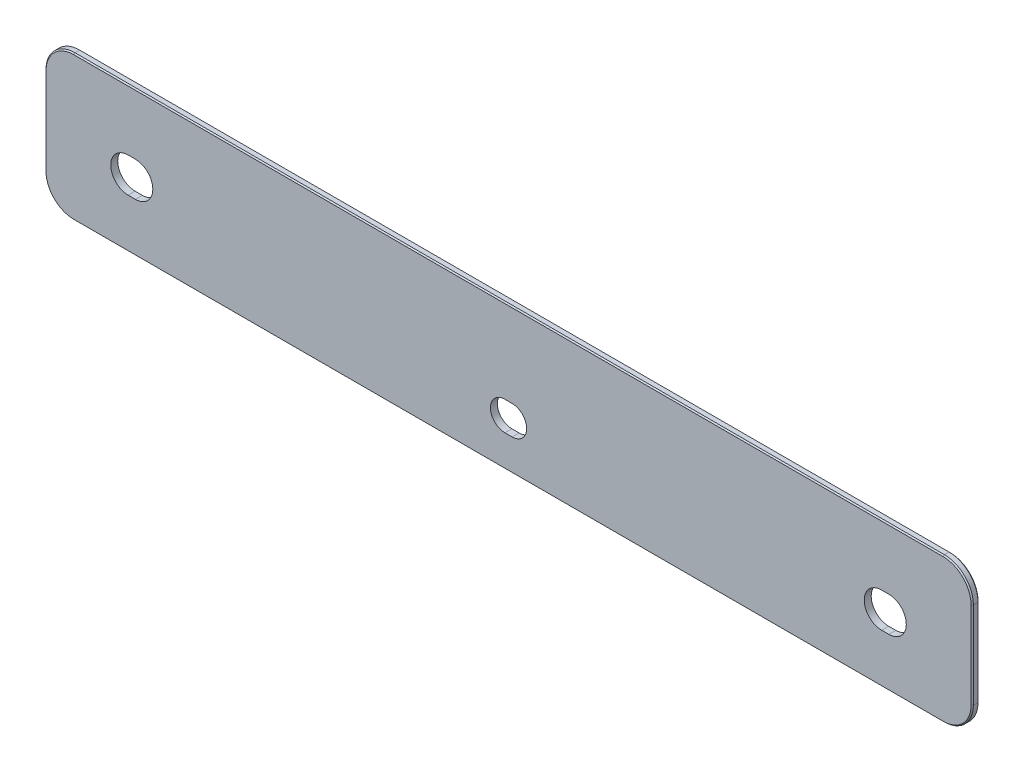
ISO-10303-21;
HEADER;
FILE_DESCRIPTION(('STEP AP214'),'2;1');
FILE_NAME('part.step','',(''),(''),'','','');
FILE_SCHEMA(('AUTOMOTIVE_DESIGN { 1 0 10303 214 1 1 1 1 }'));
ENDSEC;
DATA;
#1=APPLICATION_CONTEXT('core data for automotive mechanical design processes');
#2=APPLICATION_PROTOCOL_DEFINITION('international standard','automotive_design',2000,#1);
#3=PRODUCT_CONTEXT('',#1,'mechanical');
#4=PRODUCT('Part','Part','',(#3));
#5=PRODUCT_RELATED_PRODUCT_CATEGORY('part','',(#4));
#6=PRODUCT_DEFINITION_FORMATION('','',#4);
#7=PRODUCT_DEFINITION_CONTEXT('part definition',#1,'design');
#8=PRODUCT_DEFINITION('design','',#6,#7);
#9=PRODUCT_DEFINITION_SHAPE('','',#8);
#10=(LENGTH_UNIT() NAMED_UNIT(*) SI_UNIT(.MILLI.,.METRE.));
#11=(NAMED_UNIT(*) PLANE_ANGLE_UNIT() SI_UNIT($,.RADIAN.));
#12=(NAMED_UNIT(*) SI_UNIT($,.STERADIAN.) SOLID_ANGLE_UNIT());
#13=UNCERTAINTY_MEASURE_WITH_UNIT(LENGTH_MEASURE(1.E-05),#10,'distance_accuracy_value','');
#14=(GEOMETRIC_REPRESENTATION_CONTEXT(3) GLOBAL_UNCERTAINTY_ASSIGNED_CONTEXT((#13)) GLOBAL_UNIT_ASSIGNED_CONTEXT((#10,
#11,#12)) REPRESENTATION_CONTEXT('',''));
#15=CARTESIAN_POINT('',(0.,0.,0.));
#16=DIRECTION('',(0.,0.,1.));
#17=DIRECTION('',(1.,0.,0.));
#18=AXIS2_PLACEMENT_3D('',#15,#16,#17);
#19=CARTESIAN_POINT('',(0.,0.,2.4));
#20=DIRECTION('',(0.,0.,-1.));
#21=DIRECTION('',(-1.,0.,0.));
#22=AXIS2_PLACEMENT_3D('',#19,#20,#21);
#23=PLANE('',#22);
#24=CARTESIAN_POINT('',(150.,-13.,2.4));
#25=DIRECTION('',(0.,0.,-1.));
#26=DIRECTION('',(-1.,0.,0.));
#27=AXIS2_PLACEMENT_3D('',#24,#25,#26);
#28=CIRCLE('',#27,9.60000000000005);
#29=CARTESIAN_POINT('',(150.,-22.6000000000001,2.4));
#30=VERTEX_POINT('',#29);
#31=CARTESIAN_POINT('',(159.6,-13.,2.4));
#32=VERTEX_POINT('',#31);
#33=EDGE_CURVE('E367',#30,#32,#28,.F.);
#34=ORIENTED_EDGE('',*,*,#33,.T.);
#35=DIRECTION('',(0.,1.,0.));
#36=VECTOR('',#35,1.);
#37=CARTESIAN_POINT('',(159.6,0.,2.4));
#38=LINE('',#37,#36);
#39=CARTESIAN_POINT('',(159.6,17.,2.4));
#40=VERTEX_POINT('',#39);
#41=EDGE_CURVE('E371',#32,#40,#38,.T.);
#42=ORIENTED_EDGE('',*,*,#41,.T.);
#43=CARTESIAN_POINT('',(150.,17.,2.4));
#44=DIRECTION('',(0.,0.,-1.));
#45=DIRECTION('',(-1.,0.,0.));
#46=AXIS2_PLACEMENT_3D('',#43,#44,#45);
#47=CIRCLE('',#46,9.60000000000005);
#48=CARTESIAN_POINT('',(150.,26.6000000000001,2.4));
#49=VERTEX_POINT('',#48);
#50=EDGE_CURVE('E369',#40,#49,#47,.F.);
#51=ORIENTED_EDGE('',*,*,#50,.T.);
#52=DIRECTION('',(-1.,0.,0.));
#53=VECTOR('',#52,1.);
#54=CARTESIAN_POINT('',(0.,26.6000000000001,2.4));
#55=LINE('',#54,#53);
#56=CARTESIAN_POINT('',(-150.,26.6000000000001,2.4));
#57=VERTEX_POINT('',#56);
#58=EDGE_CURVE('E365',#49,#57,#55,.T.);
#59=ORIENTED_EDGE('',*,*,#58,.T.);
#60=CARTESIAN_POINT('',(-150.,17.,2.4));
#61=DIRECTION('',(0.,0.,-1.));
#62=DIRECTION('',(-1.,0.,0.));
#63=AXIS2_PLACEMENT_3D('',#60,#61,#62);
#64=CIRCLE('',#63,9.60000000000005);
#65=CARTESIAN_POINT('',(-159.6,17.,2.4));
#66=VERTEX_POINT('',#65);
#67=EDGE_CURVE('E361',#57,#66,#64,.F.);
#68=ORIENTED_EDGE('',*,*,#67,.T.);
#69=DIRECTION('',(0.,-1.,0.));
#70=VECTOR('',#69,1.);
#71=CARTESIAN_POINT('',(-159.6,0.,2.4));
#72=LINE('',#71,#70);
#73=CARTESIAN_POINT('',(-159.6,-13.,2.4));
#74=VERTEX_POINT('',#73);
#75=EDGE_CURVE('E357',#66,#74,#72,.T.);
#76=ORIENTED_EDGE('',*,*,#75,.T.);
#77=CARTESIAN_POINT('',(-150.,-13.,2.4));
#78=DIRECTION('',(0.,0.,-1.));
#79=DIRECTION('',(-1.,0.,0.));
#80=AXIS2_PLACEMENT_3D('',#77,#78,#79);
#81=CIRCLE('',#80,9.60000000000004);
#82=CARTESIAN_POINT('',(-150.,-22.6,2.4));
#83=VERTEX_POINT('',#82);
#84=EDGE_CURVE('E359',#74,#83,#81,.F.);
#85=ORIENTED_EDGE('',*,*,#84,.T.);
#86=DIRECTION('',(1.,0.,0.));
#87=VECTOR('',#86,1.);
#88=CARTESIAN_POINT('',(0.,-22.6000000000001,2.4));
#89=LINE('',#88,#87);
#90=EDGE_CURVE('E363',#83,#30,#89,.T.);
#91=ORIENTED_EDGE('',*,*,#90,.T.);
#92=EDGE_LOOP('',(#34,#42,#51,#59,#68,#76,#85,#91));
#93=FACE_BOUND('',#92,.T.);
#94=CARTESIAN_POINT('',(131.25,0.,2.4));
#95=DIRECTION('',(0.,0.,1.));
#96=DIRECTION('',(1.,0.,0.));
#97=AXIS2_PLACEMENT_3D('',#94,#95,#96);
#98=CIRCLE('',#97,6.00000000000001);
#99=CARTESIAN_POINT('',(131.25,-5.99999999999999,2.4));
#100=VERTEX_POINT('',#99);
#101=CARTESIAN_POINT('',(131.25,6.00000000000003,2.4));
#102=VERTEX_POINT('',#101);
#103=EDGE_CURVE('E272',#100,#102,#98,.T.);
#104=ORIENTED_EDGE('',*,*,#103,.F.);
#105=DIRECTION('',(1.,0.,0.));
#106=VECTOR('',#105,1.);
#107=CARTESIAN_POINT('',(131.25,-5.99999999999999,2.4));
#108=LINE('',#107,#106);
#109=CARTESIAN_POINT('',(128.75,-5.99999999999999,2.4));
#110=VERTEX_POINT('',#109);
#111=EDGE_CURVE('E280',#110,#100,#108,.T.);
#112=ORIENTED_EDGE('',*,*,#111,.F.);
#113=CARTESIAN_POINT('',(128.75,0.,2.4));
#114=DIRECTION('',(0.,0.,1.));
#115=DIRECTION('',(1.,0.,0.));
#116=AXIS2_PLACEMENT_3D('',#113,#114,#115);
#117=CIRCLE('',#116,6.00000000000001);
#118=CARTESIAN_POINT('',(128.75,6.00000000000002,2.4));
#119=VERTEX_POINT('',#118);
#120=EDGE_CURVE('E277',#119,#110,#117,.T.);
#121=ORIENTED_EDGE('',*,*,#120,.F.);
#122=DIRECTION('',(-1.,0.,0.));
#123=VECTOR('',#122,1.);
#124=CARTESIAN_POINT('',(131.25,6.00000000000003,2.4));
#125=LINE('',#124,#123);
#126=EDGE_CURVE('E274',#102,#119,#125,.T.);
#127=ORIENTED_EDGE('',*,*,#126,.F.);
#128=EDGE_LOOP('',(#104,#112,#121,#127));
#129=FACE_BOUND('',#128,.T.);
#130=CARTESIAN_POINT('',(-128.75,0.,2.4));
#131=DIRECTION('',(0.,0.,1.));
#132=DIRECTION('',(1.,0.,0.));
#133=AXIS2_PLACEMENT_3D('',#130,#131,#132);
#134=CIRCLE('',#133,6.00000000000005);
#135=CARTESIAN_POINT('',(-128.75,-6.00000000000005,2.4));
#136=VERTEX_POINT('',#135);
#137=CARTESIAN_POINT('',(-128.75,6.00000000000005,2.4));
#138=VERTEX_POINT('',#137);
#139=EDGE_CURVE('E303',#136,#138,#134,.T.);
#140=ORIENTED_EDGE('',*,*,#139,.F.);
#141=DIRECTION('',(1.,0.,0.));
#142=VECTOR('',#141,1.);
#143=CARTESIAN_POINT('',(-128.75,-6.00000000000005,2.4));
#144=LINE('',#143,#142);
#145=CARTESIAN_POINT('',(-131.25,-6.00000000000005,2.4));
#146=VERTEX_POINT('',#145);
#147=EDGE_CURVE('E311',#146,#136,#144,.T.);
#148=ORIENTED_EDGE('',*,*,#147,.F.);
#149=CARTESIAN_POINT('',(-131.25,0.,2.4));
#150=DIRECTION('',(0.,0.,1.));
#151=DIRECTION('',(1.,0.,0.));
#152=AXIS2_PLACEMENT_3D('',#149,#150,#151);
#153=CIRCLE('',#152,6.00000000000005);
#154=CARTESIAN_POINT('',(-131.25,6.00000000000005,2.4));
#155=VERTEX_POINT('',#154);
#156=EDGE_CURVE('E308',#155,#146,#153,.T.);
#157=ORIENTED_EDGE('',*,*,#156,.F.);
#158=DIRECTION('',(-1.,0.,0.));
#159=VECTOR('',#158,1.);
#160=CARTESIAN_POINT('',(-128.75,6.00000000000005,2.4));
#161=LINE('',#160,#159);
#162=EDGE_CURVE('E305',#138,#155,#161,.T.);
#163=ORIENTED_EDGE('',*,*,#162,.F.);
#164=EDGE_LOOP('',(#140,#148,#157,#163));
#165=FACE_BOUND('',#164,.T.);
#166=CARTESIAN_POINT('',(-1.25,-7.,2.4));
#167=DIRECTION('',(0.,0.,1.));
#168=DIRECTION('',(1.,0.,0.));
#169=AXIS2_PLACEMENT_3D('',#166,#167,#168);
#170=CIRCLE('',#169,5.);
#171=CARTESIAN_POINT('',(-1.25,-2.,2.4));
#172=VERTEX_POINT('',#171);
#173=CARTESIAN_POINT('',(-1.25,-12.,2.4));
#174=VERTEX_POINT('',#173);
#175=EDGE_CURVE('E230',#172,#174,#170,.T.);
#176=ORIENTED_EDGE('',*,*,#175,.F.);
#177=DIRECTION('',(-1.,0.,0.));
#178=VECTOR('',#177,1.);
#179=CARTESIAN_POINT('',(-1.25,-2.,2.4));
#180=LINE('',#179,#178);
#181=CARTESIAN_POINT('',(1.25,-2.,2.4));
#182=VERTEX_POINT('',#181);
#183=EDGE_CURVE('E255',#182,#172,#180,.T.);
#184=ORIENTED_EDGE('',*,*,#183,.F.);
#185=CARTESIAN_POINT('',(1.25,-7.,2.4));
#186=DIRECTION('',(0.,0.,1.));
#187=DIRECTION('',(1.,0.,0.));
#188=AXIS2_PLACEMENT_3D('',#185,#186,#187);
#189=CIRCLE('',#188,5.);
#190=CARTESIAN_POINT('',(1.25,-12.,2.4));
#191=VERTEX_POINT('',#190);
#192=EDGE_CURVE('E253',#191,#182,#189,.T.);
#193=ORIENTED_EDGE('',*,*,#192,.F.);
#194=DIRECTION('',(1.,0.,0.));
#195=VECTOR('',#194,1.);
#196=CARTESIAN_POINT('',(-1.25,-12.,2.4));
#197=LINE('',#196,#195);
#198=EDGE_CURVE('E240',#174,#191,#197,.T.);
#199=ORIENTED_EDGE('',*,*,#198,.F.);
#200=EDGE_LOOP('',(#176,#184,#193,#199));
#201=FACE_BOUND('',#200,.T.);
#202=ADVANCED_FACE('F41',(#93,#129,#165,#201),#23,.F.);
#203=CARTESIAN_POINT('',(0.,0.,0.));
#204=DIRECTION('',(0.,0.,-1.));
#205=DIRECTION('',(-1.,0.,0.));
#206=AXIS2_PLACEMENT_3D('',#203,#204,#205);
#207=PLANE('',#206);
#208=CARTESIAN_POINT('',(150.,17.,0.));
#209=DIRECTION('',(0.,0.,-1.));
#210=DIRECTION('',(-1.,0.,0.));
#211=AXIS2_PLACEMENT_3D('',#208,#209,#210);
#212=CIRCLE('',#211,9.6);
#213=CARTESIAN_POINT('',(150.,26.6,0.));
#214=VERTEX_POINT('',#213);
#215=CARTESIAN_POINT('',(159.6,17.,0.));
#216=VERTEX_POINT('',#215);
#217=EDGE_CURVE('E51',#214,#216,#212,.T.);
#218=ORIENTED_EDGE('',*,*,#217,.T.);
#219=DIRECTION('',(0.,-1.,0.));
#220=VECTOR('',#219,1.);
#221=CARTESIAN_POINT('',(159.6,-13.,0.));
#222=LINE('',#221,#220);
#223=CARTESIAN_POINT('',(159.6,-13.,0.));
#224=VERTEX_POINT('',#223);
#225=EDGE_CURVE('E11',#216,#224,#222,.T.);
#226=ORIENTED_EDGE('',*,*,#225,.T.);
#227=CARTESIAN_POINT('',(150.,-13.,0.));
#228=DIRECTION('',(0.,0.,-1.));
#229=DIRECTION('',(-1.,0.,0.));
#230=AXIS2_PLACEMENT_3D('',#227,#228,#229);
#231=CIRCLE('',#230,9.6);
#232=CARTESIAN_POINT('',(150.,-22.6,0.));
#233=VERTEX_POINT('',#232);
#234=EDGE_CURVE('E418',#224,#233,#231,.T.);
#235=ORIENTED_EDGE('',*,*,#234,.T.);
#236=DIRECTION('',(-1.,0.,0.));
#237=VECTOR('',#236,1.);
#238=CARTESIAN_POINT('',(-150.,-22.6,0.));
#239=LINE('',#238,#237);
#240=CARTESIAN_POINT('',(-150.,-22.6,0.));
#241=VERTEX_POINT('',#240);
#242=EDGE_CURVE('E414',#233,#241,#239,.T.);
#243=ORIENTED_EDGE('',*,*,#242,.T.);
#244=CARTESIAN_POINT('',(-150.,-13.,0.));
#245=DIRECTION('',(0.,0.,-1.));
#246=DIRECTION('',(-1.,0.,0.));
#247=AXIS2_PLACEMENT_3D('',#244,#245,#246);
#248=CIRCLE('',#247,9.6);
#249=CARTESIAN_POINT('',(-159.6,-13.,0.));
#250=VERTEX_POINT('',#249);
#251=EDGE_CURVE('E410',#241,#250,#248,.T.);
#252=ORIENTED_EDGE('',*,*,#251,.T.);
#253=DIRECTION('',(0.,1.,0.));
#254=VECTOR('',#253,1.);
#255=CARTESIAN_POINT('',(-159.6,17.,0.));
#256=LINE('',#255,#254);
#257=CARTESIAN_POINT('',(-159.6,17.,0.));
#258=VERTEX_POINT('',#257);
#259=EDGE_CURVE('E408',#250,#258,#256,.T.);
#260=ORIENTED_EDGE('',*,*,#259,.T.);
#261=CARTESIAN_POINT('',(-150.,17.,0.));
#262=DIRECTION('',(0.,0.,-1.));
#263=DIRECTION('',(-1.,0.,0.));
#264=AXIS2_PLACEMENT_3D('',#261,#262,#263);
#265=CIRCLE('',#264,9.6);
#266=CARTESIAN_POINT('',(-150.,26.6,0.));
#267=VERTEX_POINT('',#266);
#268=EDGE_CURVE('E412',#258,#267,#265,.T.);
#269=ORIENTED_EDGE('',*,*,#268,.T.);
#270=DIRECTION('',(1.,0.,0.));
#271=VECTOR('',#270,1.);
#272=CARTESIAN_POINT('',(150.,26.6,0.));
#273=LINE('',#272,#271);
#274=EDGE_CURVE('E416',#267,#214,#273,.T.);
#275=ORIENTED_EDGE('',*,*,#274,.T.);
#276=EDGE_LOOP('',(#218,#226,#235,#243,#252,#260,#269,#275));
#277=FACE_BOUND('',#276,.T.);
#278=DIRECTION('',(1.,0.,0.));
#279=VECTOR('',#278,1.);
#280=CARTESIAN_POINT('',(-128.75,-6.00000000000005,0.));
#281=LINE('',#280,#279);
#282=CARTESIAN_POINT('',(-131.25,-6.00000000000005,0.));
#283=VERTEX_POINT('',#282);
#284=CARTESIAN_POINT('',(-128.75,-6.00000000000005,0.));
#285=VERTEX_POINT('',#284);
#286=EDGE_CURVE('E306',#283,#285,#281,.T.);
#287=ORIENTED_EDGE('',*,*,#286,.T.);
#288=CARTESIAN_POINT('',(-128.75,0.,0.));
#289=DIRECTION('',(0.,0.,1.));
#290=DIRECTION('',(1.,0.,0.));
#291=AXIS2_PLACEMENT_3D('',#288,#289,#290);
#292=CIRCLE('',#291,6.00000000000005);
#293=CARTESIAN_POINT('',(-128.75,6.00000000000005,0.));
#294=VERTEX_POINT('',#293);
#295=EDGE_CURVE('E302',#285,#294,#292,.T.);
#296=ORIENTED_EDGE('',*,*,#295,.T.);
#297=DIRECTION('',(-1.,0.,0.));
#298=VECTOR('',#297,1.);
#299=CARTESIAN_POINT('',(-128.75,6.00000000000005,0.));
#300=LINE('',#299,#298);
#301=CARTESIAN_POINT('',(-131.25,6.00000000000005,0.));
#302=VERTEX_POINT('',#301);
#303=EDGE_CURVE('E316',#294,#302,#300,.T.);
#304=ORIENTED_EDGE('',*,*,#303,.T.);
#305=CARTESIAN_POINT('',(-131.25,0.,0.));
#306=DIRECTION('',(0.,0.,1.));
#307=DIRECTION('',(1.,0.,0.));
#308=AXIS2_PLACEMENT_3D('',#305,#306,#307);
#309=CIRCLE('',#308,6.00000000000005);
#310=EDGE_CURVE('E319',#302,#283,#309,.T.);
#311=ORIENTED_EDGE('',*,*,#310,.T.);
#312=EDGE_LOOP('',(#287,#296,#304,#311));
#313=FACE_BOUND('',#312,.T.);
#314=DIRECTION('',(1.,0.,0.));
#315=VECTOR('',#314,1.);
#316=CARTESIAN_POINT('',(131.25,-5.99999999999999,0.));
#317=LINE('',#316,#315);
#318=CARTESIAN_POINT('',(128.75,-5.99999999999999,0.));
#319=VERTEX_POINT('',#318);
#320=CARTESIAN_POINT('',(131.25,-5.99999999999999,0.));
#321=VERTEX_POINT('',#320);
#322=EDGE_CURVE('E275',#319,#321,#317,.T.);
#323=ORIENTED_EDGE('',*,*,#322,.T.);
#324=CARTESIAN_POINT('',(131.25,0.,0.));
#325=DIRECTION('',(0.,0.,1.));
#326=DIRECTION('',(1.,0.,0.));
#327=AXIS2_PLACEMENT_3D('',#324,#325,#326);
#328=CIRCLE('',#327,6.00000000000001);
#329=CARTESIAN_POINT('',(131.25,6.00000000000003,0.));
#330=VERTEX_POINT('',#329);
#331=EDGE_CURVE('E248',#321,#330,#328,.T.);
#332=ORIENTED_EDGE('',*,*,#331,.T.);
#333=DIRECTION('',(-1.,0.,0.));
#334=VECTOR('',#333,1.);
#335=CARTESIAN_POINT('',(131.25,6.00000000000003,0.));
#336=LINE('',#335,#334);
#337=CARTESIAN_POINT('',(128.75,6.00000000000002,0.));
#338=VERTEX_POINT('',#337);
#339=EDGE_CURVE('E285',#330,#338,#336,.T.);
#340=ORIENTED_EDGE('',*,*,#339,.T.);
#341=CARTESIAN_POINT('',(128.75,0.,0.));
#342=DIRECTION('',(0.,0.,1.));
#343=DIRECTION('',(1.,0.,0.));
#344=AXIS2_PLACEMENT_3D('',#341,#342,#343);
#345=CIRCLE('',#344,6.00000000000001);
#346=EDGE_CURVE('E288',#338,#319,#345,.T.);
#347=ORIENTED_EDGE('',*,*,#346,.T.);
#348=EDGE_LOOP('',(#323,#332,#340,#347));
#349=FACE_BOUND('',#348,.T.);
#350=DIRECTION('',(-1.,0.,0.));
#351=VECTOR('',#350,1.);
#352=CARTESIAN_POINT('',(-1.25,-2.,0.));
#353=LINE('',#352,#351);
#354=CARTESIAN_POINT('',(1.25,-2.,0.));
#355=VERTEX_POINT('',#354);
#356=CARTESIAN_POINT('',(-1.25,-2.,0.));
#357=VERTEX_POINT('',#356);
#358=EDGE_CURVE('E241',#355,#357,#353,.T.);
#359=ORIENTED_EDGE('',*,*,#358,.T.);
#360=CARTESIAN_POINT('',(-1.25,-7.,0.));
#361=DIRECTION('',(0.,0.,1.));
#362=DIRECTION('',(1.,0.,0.));
#363=AXIS2_PLACEMENT_3D('',#360,#361,#362);
#364=CIRCLE('',#363,5.);
#365=CARTESIAN_POINT('',(-1.25,-12.,0.));
#366=VERTEX_POINT('',#365);
#367=EDGE_CURVE('E259',#357,#366,#364,.T.);
#368=ORIENTED_EDGE('',*,*,#367,.T.);
#369=DIRECTION('',(1.,0.,0.));
#370=VECTOR('',#369,1.);
#371=CARTESIAN_POINT('',(-1.25,-12.,0.));
#372=LINE('',#371,#370);
#373=CARTESIAN_POINT('',(1.25,-12.,0.));
#374=VERTEX_POINT('',#373);
#375=EDGE_CURVE('E247',#366,#374,#372,.T.);
#376=ORIENTED_EDGE('',*,*,#375,.T.);
#377=CARTESIAN_POINT('',(1.25,-7.,0.));
#378=DIRECTION('',(0.,0.,1.));
#379=DIRECTION('',(1.,0.,0.));
#380=AXIS2_PLACEMENT_3D('',#377,#378,#379);
#381=CIRCLE('',#380,5.);
#382=EDGE_CURVE('E263',#374,#355,#381,.T.);
#383=ORIENTED_EDGE('',*,*,#382,.T.);
#384=EDGE_LOOP('',(#359,#368,#376,#383));
#385=FACE_BOUND('',#384,.T.);
#386=ADVANCED_FACE('F472',(#277,#313,#349,#385),#207,.T.);
#387=CARTESIAN_POINT('',(160.,27.,2.4));
#388=DIRECTION('',(0.,-1.,0.));
#389=DIRECTION('',(1.,0.,0.));
#390=AXIS2_PLACEMENT_3D('',#387,#388,#389);
#391=PLANE('',#390);
#392=DIRECTION('',(0.,0.,-1.));
#393=VECTOR('',#392,1.);
#394=CARTESIAN_POINT('',(-150.,27.,2.4));
#395=LINE('',#394,#393);
#396=CARTESIAN_POINT('',(-150.,27.,0.400000000000039));
#397=VERTEX_POINT('',#396);
#398=CARTESIAN_POINT('',(-150.,27.,2.00000000000007));
#399=VERTEX_POINT('',#398);
#400=EDGE_CURVE('E333',#397,#399,#395,.F.);
#401=ORIENTED_EDGE('',*,*,#400,.T.);
#402=DIRECTION('',(1.,0.,0.));
#403=VECTOR('',#402,1.);
#404=CARTESIAN_POINT('',(160.,27.,2.00000000000007));
#405=LINE('',#404,#403);
#406=CARTESIAN_POINT('',(150.,27.,2.00000000000007));
#407=VERTEX_POINT('',#406);
#408=EDGE_CURVE('E390',#399,#407,#405,.T.);
#409=ORIENTED_EDGE('',*,*,#408,.T.);
#410=DIRECTION('',(0.,0.,-1.));
#411=VECTOR('',#410,1.);
#412=CARTESIAN_POINT('',(150.,27.,2.4));
#413=LINE('',#412,#411);
#414=CARTESIAN_POINT('',(150.,27.,0.400000000000039));
#415=VERTEX_POINT('',#414);
#416=EDGE_CURVE('E336',#407,#415,#413,.T.);
#417=ORIENTED_EDGE('',*,*,#416,.T.);
#418=DIRECTION('',(-1.,0.,0.));
#419=VECTOR('',#418,1.);
#420=CARTESIAN_POINT('',(-150.,27.,0.400000000000039));
#421=LINE('',#420,#419);
#422=EDGE_CURVE('E388',#415,#397,#421,.T.);
#423=ORIENTED_EDGE('',*,*,#422,.T.);
#424=EDGE_LOOP('',(#401,#409,#417,#423));
#425=FACE_BOUND('',#424,.T.);
#426=ADVANCED_FACE('F543',(#425),#391,.F.);
#427=CARTESIAN_POINT('',(-160.,-23.,2.4));
#428=DIRECTION('',(1.,0.,0.));
#429=DIRECTION('',(0.,1.,0.));
#430=AXIS2_PLACEMENT_3D('',#427,#428,#429);
#431=PLANE('',#430);
#432=DIRECTION('',(0.,0.,-1.));
#433=VECTOR('',#432,1.);
#434=CARTESIAN_POINT('',(-160.,-13.,2.4));
#435=LINE('',#434,#433);
#436=CARTESIAN_POINT('',(-160.,-13.,0.400000000000039));
#437=VERTEX_POINT('',#436);
#438=CARTESIAN_POINT('',(-160.,-13.,2.00000000000007));
#439=VERTEX_POINT('',#438);
#440=EDGE_CURVE('E345',#437,#439,#435,.F.);
#441=ORIENTED_EDGE('',*,*,#440,.T.);
#442=DIRECTION('',(0.,1.,0.));
#443=VECTOR('',#442,1.);
#444=CARTESIAN_POINT('',(-160.,-23.,2.00000000000007));
#445=LINE('',#444,#443);
#446=CARTESIAN_POINT('',(-160.,17.,2.00000000000007));
#447=VERTEX_POINT('',#446);
#448=EDGE_CURVE('E406',#439,#447,#445,.T.);
#449=ORIENTED_EDGE('',*,*,#448,.T.);
#450=DIRECTION('',(0.,0.,-1.));
#451=VECTOR('',#450,1.);
#452=CARTESIAN_POINT('',(-160.,17.,2.4));
#453=LINE('',#452,#451);
#454=CARTESIAN_POINT('',(-160.,17.,0.400000000000039));
#455=VERTEX_POINT('',#454);
#456=EDGE_CURVE('E348',#447,#455,#453,.T.);
#457=ORIENTED_EDGE('',*,*,#456,.T.);
#458=DIRECTION('',(0.,-1.,0.));
#459=VECTOR('',#458,1.);
#460=CARTESIAN_POINT('',(-160.,-13.,0.400000000000039));
#461=LINE('',#460,#459);
#462=EDGE_CURVE('E404',#455,#437,#461,.T.);
#463=ORIENTED_EDGE('',*,*,#462,.T.);
#464=EDGE_LOOP('',(#441,#449,#457,#463));
#465=FACE_BOUND('',#464,.T.);
#466=ADVANCED_FACE('F527',(#465),#431,.F.);
#467=CARTESIAN_POINT('',(160.,-23.,2.4));
#468=DIRECTION('',(0.,1.,0.));
#469=DIRECTION('',(-1.,0.,0.));
#470=AXIS2_PLACEMENT_3D('',#467,#468,#469);
#471=PLANE('',#470);
#472=DIRECTION('',(0.,0.,-1.));
#473=VECTOR('',#472,1.);
#474=CARTESIAN_POINT('',(150.,-23.,2.4));
#475=LINE('',#474,#473);
#476=CARTESIAN_POINT('',(150.,-23.,0.400000000000039));
#477=VERTEX_POINT('',#476);
#478=CARTESIAN_POINT('',(150.,-23.,2.00000000000007));
#479=VERTEX_POINT('',#478);
#480=EDGE_CURVE('E351',#477,#479,#475,.F.);
#481=ORIENTED_EDGE('',*,*,#480,.T.);
#482=DIRECTION('',(-1.,0.,0.));
#483=VECTOR('',#482,1.);
#484=CARTESIAN_POINT('',(160.,-23.,2.00000000000007));
#485=LINE('',#484,#483);
#486=CARTESIAN_POINT('',(-150.,-23.,2.00000000000007));
#487=VERTEX_POINT('',#486);
#488=EDGE_CURVE('E394',#479,#487,#485,.T.);
#489=ORIENTED_EDGE('',*,*,#488,.T.);
#490=DIRECTION('',(0.,0.,-1.));
#491=VECTOR('',#490,1.);
#492=CARTESIAN_POINT('',(-150.,-23.,2.4));
#493=LINE('',#492,#491);
#494=CARTESIAN_POINT('',(-150.,-23.,0.400000000000039));
#495=VERTEX_POINT('',#494);
#496=EDGE_CURVE('E354',#487,#495,#493,.T.);
#497=ORIENTED_EDGE('',*,*,#496,.T.);
#498=DIRECTION('',(1.,0.,0.));
#499=VECTOR('',#498,1.);
#500=CARTESIAN_POINT('',(150.,-23.,0.400000000000039));
#501=LINE('',#500,#499);
#502=EDGE_CURVE('E392',#495,#477,#501,.T.);
#503=ORIENTED_EDGE('',*,*,#502,.T.);
#504=EDGE_LOOP('',(#481,#489,#497,#503));
#505=FACE_BOUND('',#504,.T.);
#506=ADVANCED_FACE('F512',(#505),#471,.F.);
#507=CARTESIAN_POINT('',(160.,-23.,2.4));
#508=DIRECTION('',(-1.,0.,0.));
#509=DIRECTION('',(0.,-1.,0.));
#510=AXIS2_PLACEMENT_3D('',#507,#508,#509);
#511=PLANE('',#510);
#512=DIRECTION('',(0.,0.,-1.));
#513=VECTOR('',#512,1.);
#514=CARTESIAN_POINT('',(160.,17.,2.4));
#515=LINE('',#514,#513);
#516=CARTESIAN_POINT('',(160.,17.,0.400000000000039));
#517=VERTEX_POINT('',#516);
#518=CARTESIAN_POINT('',(160.,17.,2.00000000000007));
#519=VERTEX_POINT('',#518);
#520=EDGE_CURVE('E342',#517,#519,#515,.F.);
#521=ORIENTED_EDGE('',*,*,#520,.T.);
#522=DIRECTION('',(0.,-1.,0.));
#523=VECTOR('',#522,1.);
#524=CARTESIAN_POINT('',(160.,-23.,2.00000000000007));
#525=LINE('',#524,#523);
#526=CARTESIAN_POINT('',(160.,-13.,2.00000000000007));
#527=VERTEX_POINT('',#526);
#528=EDGE_CURVE('E377',#519,#527,#525,.T.);
#529=ORIENTED_EDGE('',*,*,#528,.T.);
#530=DIRECTION('',(0.,0.,-1.));
#531=VECTOR('',#530,1.);
#532=CARTESIAN_POINT('',(160.,-13.,2.4));
#533=LINE('',#532,#531);
#534=CARTESIAN_POINT('',(160.,-13.,0.400000000000039));
#535=VERTEX_POINT('',#534);
#536=EDGE_CURVE('E339',#527,#535,#533,.T.);
#537=ORIENTED_EDGE('',*,*,#536,.T.);
#538=DIRECTION('',(0.,1.,0.));
#539=VECTOR('',#538,1.);
#540=CARTESIAN_POINT('',(160.,17.,0.400000000000039));
#541=LINE('',#540,#539);
#542=EDGE_CURVE('E374',#535,#517,#541,.T.);
#543=ORIENTED_EDGE('',*,*,#542,.T.);
#544=EDGE_LOOP('',(#521,#529,#537,#543));
#545=FACE_BOUND('',#544,.T.);
#546=ADVANCED_FACE('F488',(#545),#511,.F.);
#547=CARTESIAN_POINT('',(-128.75,0.,2.4));
#548=DIRECTION('',(0.,0.,-1.));
#549=DIRECTION('',(-1.,0.,0.));
#550=AXIS2_PLACEMENT_3D('',#547,#548,#549);
#551=CYLINDRICAL_SURFACE('',#550,6.00000000000005);
#552=ORIENTED_EDGE('',*,*,#295,.F.);
#553=DIRECTION('',(0.,0.,-1.));
#554=VECTOR('',#553,1.);
#555=CARTESIAN_POINT('',(-128.75,-6.00000000000005,2.4));
#556=LINE('',#555,#554);
#557=EDGE_CURVE('E313',#136,#285,#556,.T.);
#558=ORIENTED_EDGE('',*,*,#557,.F.);
#559=ORIENTED_EDGE('',*,*,#139,.T.);
#560=DIRECTION('',(0.,0.,-1.));
#561=VECTOR('',#560,1.);
#562=CARTESIAN_POINT('',(-128.75,6.00000000000005,2.4));
#563=LINE('',#562,#561);
#564=EDGE_CURVE('E330',#138,#294,#563,.T.);
#565=ORIENTED_EDGE('',*,*,#564,.T.);
#566=EDGE_LOOP('',(#552,#558,#559,#565));
#567=FACE_BOUND('',#566,.T.);
#568=ADVANCED_FACE('F571',(#567),#551,.F.);
#569=CARTESIAN_POINT('',(-128.75,6.00000000000005,2.4));
#570=DIRECTION('',(0.,-1.,0.));
#571=DIRECTION('',(0.,0.,-1.));
#572=AXIS2_PLACEMENT_3D('',#569,#570,#571);
#573=PLANE('',#572);
#574=ORIENTED_EDGE('',*,*,#303,.F.);
#575=ORIENTED_EDGE('',*,*,#564,.F.);
#576=ORIENTED_EDGE('',*,*,#162,.T.);
#577=DIRECTION('',(0.,0.,-1.));
#578=VECTOR('',#577,1.);
#579=CARTESIAN_POINT('',(-131.25,6.00000000000005,2.4));
#580=LINE('',#579,#578);
#581=EDGE_CURVE('E328',#155,#302,#580,.T.);
#582=ORIENTED_EDGE('',*,*,#581,.T.);
#583=EDGE_LOOP('',(#574,#575,#576,#582));
#584=FACE_BOUND('',#583,.T.);
#585=ADVANCED_FACE('F840',(#584),#573,.T.);
#586=CARTESIAN_POINT('',(-131.25,0.,2.4));
#587=DIRECTION('',(0.,0.,-1.));
#588=DIRECTION('',(-1.,0.,0.));
#589=AXIS2_PLACEMENT_3D('',#586,#587,#588);
#590=CYLINDRICAL_SURFACE('',#589,6.00000000000005);
#591=ORIENTED_EDGE('',*,*,#310,.F.);
#592=ORIENTED_EDGE('',*,*,#581,.F.);
#593=ORIENTED_EDGE('',*,*,#156,.T.);
#594=DIRECTION('',(0.,0.,-1.));
#595=VECTOR('',#594,1.);
#596=CARTESIAN_POINT('',(-131.25,-6.00000000000005,2.4));
#597=LINE('',#596,#595);
#598=EDGE_CURVE('E326',#146,#283,#597,.T.);
#599=ORIENTED_EDGE('',*,*,#598,.T.);
#600=EDGE_LOOP('',(#591,#592,#593,#599));
#601=FACE_BOUND('',#600,.T.);
#602=ADVANCED_FACE('F831',(#601),#590,.F.);
#603=CARTESIAN_POINT('',(-128.75,-6.00000000000005,2.4));
#604=DIRECTION('',(0.,1.,0.));
#605=DIRECTION('',(0.,0.,1.));
#606=AXIS2_PLACEMENT_3D('',#603,#604,#605);
#607=PLANE('',#606);
#608=ORIENTED_EDGE('',*,*,#286,.F.);
#609=ORIENTED_EDGE('',*,*,#598,.F.);
#610=ORIENTED_EDGE('',*,*,#147,.T.);
#611=ORIENTED_EDGE('',*,*,#557,.T.);
#612=EDGE_LOOP('',(#608,#609,#610,#611));
#613=FACE_BOUND('',#612,.T.);
#614=ADVANCED_FACE('F822',(#613),#607,.T.);
#615=CARTESIAN_POINT('',(131.25,0.,2.4));
#616=DIRECTION('',(0.,0.,-1.));
#617=DIRECTION('',(-1.,0.,0.));
#618=AXIS2_PLACEMENT_3D('',#615,#616,#617);
#619=CYLINDRICAL_SURFACE('',#618,6.00000000000001);
#620=ORIENTED_EDGE('',*,*,#331,.F.);
#621=DIRECTION('',(0.,0.,-1.));
#622=VECTOR('',#621,1.);
#623=CARTESIAN_POINT('',(131.25,-5.99999999999999,2.4));
#624=LINE('',#623,#622);
#625=EDGE_CURVE('E282',#100,#321,#624,.T.);
#626=ORIENTED_EDGE('',*,*,#625,.F.);
#627=ORIENTED_EDGE('',*,*,#103,.T.);
#628=DIRECTION('',(0.,0.,-1.));
#629=VECTOR('',#628,1.);
#630=CARTESIAN_POINT('',(131.25,6.00000000000003,2.4));
#631=LINE('',#630,#629);
#632=EDGE_CURVE('E299',#102,#330,#631,.T.);
#633=ORIENTED_EDGE('',*,*,#632,.T.);
#634=EDGE_LOOP('',(#620,#626,#627,#633));
#635=FACE_BOUND('',#634,.T.);
#636=ADVANCED_FACE('F813',(#635),#619,.F.);
#637=CARTESIAN_POINT('',(131.25,6.00000000000003,2.4));
#638=DIRECTION('',(0.,-1.,0.));
#639=DIRECTION('',(0.,0.,-1.));
#640=AXIS2_PLACEMENT_3D('',#637,#638,#639);
#641=PLANE('',#640);
#642=ORIENTED_EDGE('',*,*,#339,.F.);
#643=ORIENTED_EDGE('',*,*,#632,.F.);
#644=ORIENTED_EDGE('',*,*,#126,.T.);
#645=DIRECTION('',(0.,0.,-1.));
#646=VECTOR('',#645,1.);
#647=CARTESIAN_POINT('',(128.75,6.00000000000002,2.4));
#648=LINE('',#647,#646);
#649=EDGE_CURVE('E297',#119,#338,#648,.T.);
#650=ORIENTED_EDGE('',*,*,#649,.T.);
#651=EDGE_LOOP('',(#642,#643,#644,#650));
#652=FACE_BOUND('',#651,.T.);
#653=ADVANCED_FACE('F804',(#652),#641,.T.);
#654=CARTESIAN_POINT('',(128.75,0.,2.4));
#655=DIRECTION('',(0.,0.,-1.));
#656=DIRECTION('',(-1.,0.,0.));
#657=AXIS2_PLACEMENT_3D('',#654,#655,#656);
#658=CYLINDRICAL_SURFACE('',#657,6.00000000000001);
#659=ORIENTED_EDGE('',*,*,#346,.F.);
#660=ORIENTED_EDGE('',*,*,#649,.F.);
#661=ORIENTED_EDGE('',*,*,#120,.T.);
#662=DIRECTION('',(0.,0.,-1.));
#663=VECTOR('',#662,1.);
#664=CARTESIAN_POINT('',(128.75,-5.99999999999999,2.4));
#665=LINE('',#664,#663);
#666=EDGE_CURVE('E295',#110,#319,#665,.T.);
#667=ORIENTED_EDGE('',*,*,#666,.T.);
#668=EDGE_LOOP('',(#659,#660,#661,#667));
#669=FACE_BOUND('',#668,.T.);
#670=ADVANCED_FACE('F795',(#669),#658,.F.);
#671=CARTESIAN_POINT('',(131.25,-5.99999999999999,2.4));
#672=DIRECTION('',(0.,1.,0.));
#673=DIRECTION('',(0.,0.,1.));
#674=AXIS2_PLACEMENT_3D('',#671,#672,#673);
#675=PLANE('',#674);
#676=ORIENTED_EDGE('',*,*,#322,.F.);
#677=ORIENTED_EDGE('',*,*,#666,.F.);
#678=ORIENTED_EDGE('',*,*,#111,.T.);
#679=ORIENTED_EDGE('',*,*,#625,.T.);
#680=EDGE_LOOP('',(#676,#677,#678,#679));
#681=FACE_BOUND('',#680,.T.);
#682=ADVANCED_FACE('F787',(#681),#675,.T.);
#683=CARTESIAN_POINT('',(-1.25,-7.,2.4));
#684=DIRECTION('',(0.,0.,-1.));
#685=DIRECTION('',(-1.,0.,0.));
#686=AXIS2_PLACEMENT_3D('',#683,#684,#685);
#687=CYLINDRICAL_SURFACE('',#686,5.);
#688=ORIENTED_EDGE('',*,*,#367,.F.);
#689=DIRECTION('',(0.,0.,-1.));
#690=VECTOR('',#689,1.);
#691=CARTESIAN_POINT('',(-1.25,-2.,2.4));
#692=LINE('',#691,#690);
#693=EDGE_CURVE('E236',#172,#357,#692,.T.);
#694=ORIENTED_EDGE('',*,*,#693,.F.);
#695=ORIENTED_EDGE('',*,*,#175,.T.);
#696=DIRECTION('',(0.,0.,-1.));
#697=VECTOR('',#696,1.);
#698=CARTESIAN_POINT('',(-1.25,-12.,2.4));
#699=LINE('',#698,#697);
#700=EDGE_CURVE('E233',#174,#366,#699,.T.);
#701=ORIENTED_EDGE('',*,*,#700,.T.);
#702=EDGE_LOOP('',(#688,#694,#695,#701));
#703=FACE_BOUND('',#702,.T.);
#704=ADVANCED_FACE('F232',(#703),#687,.F.);
#705=CARTESIAN_POINT('',(-1.25,-12.,2.4));
#706=DIRECTION('',(0.,1.,0.));
#707=DIRECTION('',(0.,0.,1.));
#708=AXIS2_PLACEMENT_3D('',#705,#706,#707);
#709=PLANE('',#708);
#710=ORIENTED_EDGE('',*,*,#375,.F.);
#711=ORIENTED_EDGE('',*,*,#700,.F.);
#712=ORIENTED_EDGE('',*,*,#198,.T.);
#713=DIRECTION('',(0.,0.,-1.));
#714=VECTOR('',#713,1.);
#715=CARTESIAN_POINT('',(1.25,-12.,2.4));
#716=LINE('',#715,#714);
#717=EDGE_CURVE('E249',#191,#374,#716,.T.);
#718=ORIENTED_EDGE('',*,*,#717,.T.);
#719=EDGE_LOOP('',(#710,#711,#712,#718));
#720=FACE_BOUND('',#719,.T.);
#721=ADVANCED_FACE('F244',(#720),#709,.T.);
#722=CARTESIAN_POINT('',(1.25,-7.,2.4));
#723=DIRECTION('',(0.,0.,-1.));
#724=DIRECTION('',(-1.,0.,0.));
#725=AXIS2_PLACEMENT_3D('',#722,#723,#724);
#726=CYLINDRICAL_SURFACE('',#725,5.);
#727=ORIENTED_EDGE('',*,*,#382,.F.);
#728=ORIENTED_EDGE('',*,*,#717,.F.);
#729=ORIENTED_EDGE('',*,*,#192,.T.);
#730=DIRECTION('',(0.,0.,-1.));
#731=VECTOR('',#730,1.);
#732=CARTESIAN_POINT('',(1.25,-2.,2.4));
#733=LINE('',#732,#731);
#734=EDGE_CURVE('E269',#182,#355,#733,.T.);
#735=ORIENTED_EDGE('',*,*,#734,.T.);
#736=EDGE_LOOP('',(#727,#728,#729,#735));
#737=FACE_BOUND('',#736,.T.);
#738=ADVANCED_FACE('F763',(#737),#726,.F.);
#739=CARTESIAN_POINT('',(-1.25,-2.,2.4));
#740=DIRECTION('',(0.,-1.,0.));
#741=DIRECTION('',(1.,0.,0.));
#742=AXIS2_PLACEMENT_3D('',#739,#740,#741);
#743=PLANE('',#742);
#744=ORIENTED_EDGE('',*,*,#358,.F.);
#745=ORIENTED_EDGE('',*,*,#734,.F.);
#746=ORIENTED_EDGE('',*,*,#183,.T.);
#747=ORIENTED_EDGE('',*,*,#693,.T.);
#748=EDGE_LOOP('',(#744,#745,#746,#747));
#749=FACE_BOUND('',#748,.T.);
#750=ADVANCED_FACE('F585',(#749),#743,.T.);
#751=CARTESIAN_POINT('',(150.,17.,2.4));
#752=DIRECTION('',(0.,0.,-1.));
#753=DIRECTION('',(-1.,0.,0.));
#754=AXIS2_PLACEMENT_3D('',#751,#752,#753);
#755=CYLINDRICAL_SURFACE('',#754,10.);
#756=ORIENTED_EDGE('',*,*,#416,.F.);
#757=CARTESIAN_POINT('',(150.,17.,2.00000000000007));
#758=DIRECTION('',(0.,0.,-1.));
#759=DIRECTION('',(-1.,0.,0.));
#760=AXIS2_PLACEMENT_3D('',#757,#758,#759);
#761=CIRCLE('',#760,10.);
#762=EDGE_CURVE('E382',#407,#519,#761,.T.);
#763=ORIENTED_EDGE('',*,*,#762,.T.);
#764=ORIENTED_EDGE('',*,*,#520,.F.);
#765=CARTESIAN_POINT('',(150.,17.,0.400000000000039));
#766=DIRECTION('',(0.,0.,-1.));
#767=DIRECTION('',(-1.,0.,0.));
#768=AXIS2_PLACEMENT_3D('',#765,#766,#767);
#769=CIRCLE('',#768,10.);
#770=EDGE_CURVE('E380',#517,#415,#769,.F.);
#771=ORIENTED_EDGE('',*,*,#770,.T.);
#772=EDGE_LOOP('',(#756,#763,#764,#771));
#773=FACE_BOUND('',#772,.T.);
#774=ADVANCED_FACE('F582',(#773),#755,.T.);
#775=CARTESIAN_POINT('',(-150.,17.,2.4));
#776=DIRECTION('',(0.,0.,-1.));
#777=DIRECTION('',(-1.,0.,0.));
#778=AXIS2_PLACEMENT_3D('',#775,#776,#777);
#779=CYLINDRICAL_SURFACE('',#778,10.);
#780=ORIENTED_EDGE('',*,*,#456,.F.);
#781=CARTESIAN_POINT('',(-150.,17.,2.00000000000007));
#782=DIRECTION('',(0.,0.,-1.));
#783=DIRECTION('',(-1.,0.,0.));
#784=AXIS2_PLACEMENT_3D('',#781,#782,#783);
#785=CIRCLE('',#784,10.);
#786=EDGE_CURVE('E398',#447,#399,#785,.T.);
#787=ORIENTED_EDGE('',*,*,#786,.T.);
#788=ORIENTED_EDGE('',*,*,#400,.F.);
#789=CARTESIAN_POINT('',(-150.,17.,0.400000000000039));
#790=DIRECTION('',(0.,0.,-1.));
#791=DIRECTION('',(-1.,0.,0.));
#792=AXIS2_PLACEMENT_3D('',#789,#790,#791);
#793=CIRCLE('',#792,10.);
#794=EDGE_CURVE('E396',#397,#455,#793,.F.);
#795=ORIENTED_EDGE('',*,*,#794,.T.);
#796=EDGE_LOOP('',(#780,#787,#788,#795));
#797=FACE_BOUND('',#796,.T.);
#798=ADVANCED_FACE('F541',(#797),#779,.T.);
#799=CARTESIAN_POINT('',(-150.,-13.,2.4));
#800=DIRECTION('',(0.,0.,-1.));
#801=DIRECTION('',(-1.,0.,0.));
#802=AXIS2_PLACEMENT_3D('',#799,#800,#801);
#803=CYLINDRICAL_SURFACE('',#802,10.);
#804=ORIENTED_EDGE('',*,*,#496,.F.);
#805=CARTESIAN_POINT('',(-150.,-13.,2.00000000000007));
#806=DIRECTION('',(0.,0.,-1.));
#807=DIRECTION('',(-1.,0.,0.));
#808=AXIS2_PLACEMENT_3D('',#805,#806,#807);
#809=CIRCLE('',#808,10.);
#810=EDGE_CURVE('E402',#487,#439,#809,.T.);
#811=ORIENTED_EDGE('',*,*,#810,.T.);
#812=ORIENTED_EDGE('',*,*,#440,.F.);
#813=CARTESIAN_POINT('',(-150.,-13.,0.400000000000039));
#814=DIRECTION('',(0.,0.,-1.));
#815=DIRECTION('',(-1.,0.,0.));
#816=AXIS2_PLACEMENT_3D('',#813,#814,#815);
#817=CIRCLE('',#816,10.);
#818=EDGE_CURVE('E400',#437,#495,#817,.F.);
#819=ORIENTED_EDGE('',*,*,#818,.T.);
#820=EDGE_LOOP('',(#804,#811,#812,#819));
#821=FACE_BOUND('',#820,.T.);
#822=ADVANCED_FACE('F524',(#821),#803,.T.);
#823=CARTESIAN_POINT('',(150.,-13.,2.4));
#824=DIRECTION('',(0.,0.,-1.));
#825=DIRECTION('',(-1.,0.,0.));
#826=AXIS2_PLACEMENT_3D('',#823,#824,#825);
#827=CYLINDRICAL_SURFACE('',#826,10.);
#828=ORIENTED_EDGE('',*,*,#536,.F.);
#829=CARTESIAN_POINT('',(150.,-13.,2.00000000000007));
#830=DIRECTION('',(0.,0.,-1.));
#831=DIRECTION('',(-1.,0.,0.));
#832=AXIS2_PLACEMENT_3D('',#829,#830,#831);
#833=CIRCLE('',#832,10.);
#834=EDGE_CURVE('E386',#527,#479,#833,.T.);
#835=ORIENTED_EDGE('',*,*,#834,.T.);
#836=ORIENTED_EDGE('',*,*,#480,.F.);
#837=CARTESIAN_POINT('',(150.,-13.,0.400000000000039));
#838=DIRECTION('',(0.,0.,-1.));
#839=DIRECTION('',(-1.,0.,0.));
#840=AXIS2_PLACEMENT_3D('',#837,#838,#839);
#841=CIRCLE('',#840,10.);
#842=EDGE_CURVE('E384',#477,#535,#841,.F.);
#843=ORIENTED_EDGE('',*,*,#842,.T.);
#844=EDGE_LOOP('',(#828,#835,#836,#843));
#845=FACE_BOUND('',#844,.T.);
#846=ADVANCED_FACE('F486',(#845),#827,.T.);
#847=CARTESIAN_POINT('',(-159.6,0.,2.4));
#848=DIRECTION('',(0.707106781186512,0.,-0.707106781186583));
#849=DIRECTION('',(0.,-1.,0.));
#850=AXIS2_PLACEMENT_3D('',#847,#848,#849);
#851=PLANE('',#850);
#852=DIRECTION('',(0.707106781186572,0.,0.707106781186523));
#853=VECTOR('',#852,1.);
#854=CARTESIAN_POINT('',(-160.,17.,2.00000000000007));
#855=LINE('',#854,#853);
#856=EDGE_CURVE('E437',#447,#66,#855,.T.);
#857=ORIENTED_EDGE('',*,*,#856,.F.);
#858=ORIENTED_EDGE('',*,*,#448,.F.);
#859=DIRECTION('',(-0.707106781186572,0.,-0.707106781186523));
#860=VECTOR('',#859,1.);
#861=CARTESIAN_POINT('',(-159.6,-13.,2.4));
#862=LINE('',#861,#860);
#863=EDGE_CURVE('E261',#74,#439,#862,.T.);
#864=ORIENTED_EDGE('',*,*,#863,.F.);
#865=ORIENTED_EDGE('',*,*,#75,.F.);
#866=EDGE_LOOP('',(#857,#858,#864,#865));
#867=FACE_BOUND('',#866,.T.);
#868=ADVANCED_FACE('F531',(#867),#851,.F.);
#869=CARTESIAN_POINT('',(-150.,-13.,2.4));
#870=DIRECTION('',(0.,0.,-1.));
#871=DIRECTION('',(-1.,0.,0.));
#872=AXIS2_PLACEMENT_3D('',#869,#870,#871);
#873=CONICAL_SURFACE('',#872,9.60000000000004,0.785398163397483);
#874=ORIENTED_EDGE('',*,*,#863,.T.);
#875=ORIENTED_EDGE('',*,*,#810,.F.);
#876=DIRECTION('',(0.,-0.707106781186572,-0.707106781186523));
#877=VECTOR('',#876,1.);
#878=CARTESIAN_POINT('',(-150.,-22.6,2.4));
#879=LINE('',#878,#877);
#880=EDGE_CURVE('E434',#83,#487,#879,.T.);
#881=ORIENTED_EDGE('',*,*,#880,.F.);
#882=ORIENTED_EDGE('',*,*,#84,.F.);
#883=EDGE_LOOP('',(#874,#875,#881,#882));
#884=FACE_BOUND('',#883,.T.);
#885=ADVANCED_FACE('F520',(#884),#873,.T.);
#886=CARTESIAN_POINT('',(-150.,17.,2.4));
#887=DIRECTION('',(0.,0.,-1.));
#888=DIRECTION('',(-1.,0.,0.));
#889=AXIS2_PLACEMENT_3D('',#886,#887,#888);
#890=CONICAL_SURFACE('',#889,9.60000000000005,0.785398163397472);
#891=ORIENTED_EDGE('',*,*,#856,.T.);
#892=ORIENTED_EDGE('',*,*,#67,.F.);
#893=DIRECTION('',(0.,-0.707106781186566,0.707106781186529));
#894=VECTOR('',#893,1.);
#895=CARTESIAN_POINT('',(-150.,27.,2.00000000000007));
#896=LINE('',#895,#894);
#897=EDGE_CURVE('E431',#399,#57,#896,.T.);
#898=ORIENTED_EDGE('',*,*,#897,.F.);
#899=ORIENTED_EDGE('',*,*,#786,.F.);
#900=EDGE_LOOP('',(#891,#892,#898,#899));
#901=FACE_BOUND('',#900,.T.);
#902=ADVANCED_FACE('F537',(#901),#890,.T.);
#903=CARTESIAN_POINT('',(0.,-22.6000000000001,2.4));
#904=DIRECTION('',(0.,0.707106781186521,-0.707106781186574));
#905=DIRECTION('',(1.,0.,0.));
#906=AXIS2_PLACEMENT_3D('',#903,#904,#905);
#907=PLANE('',#906);
#908=ORIENTED_EDGE('',*,*,#880,.T.);
#909=ORIENTED_EDGE('',*,*,#488,.F.);
#910=DIRECTION('',(0.,-0.707106781186575,-0.70710678118652));
#911=VECTOR('',#910,1.);
#912=CARTESIAN_POINT('',(150.,-22.6000000000001,2.4));
#913=LINE('',#912,#911);
#914=EDGE_CURVE('E428',#30,#479,#913,.T.);
#915=ORIENTED_EDGE('',*,*,#914,.F.);
#916=ORIENTED_EDGE('',*,*,#90,.F.);
#917=EDGE_LOOP('',(#908,#909,#915,#916));
#918=FACE_BOUND('',#917,.T.);
#919=ADVANCED_FACE('F515',(#918),#907,.F.);
#920=CARTESIAN_POINT('',(0.,26.6000000000001,2.4));
#921=DIRECTION('',(0.,-0.707106781186524,-0.707106781186571));
#922=DIRECTION('',(-1.,0.,0.));
#923=AXIS2_PLACEMENT_3D('',#920,#921,#922);
#924=PLANE('',#923);
#925=ORIENTED_EDGE('',*,*,#897,.T.);
#926=ORIENTED_EDGE('',*,*,#58,.F.);
#927=DIRECTION('',(0.,-0.707106781186572,0.707106781186523));
#928=VECTOR('',#927,1.);
#929=CARTESIAN_POINT('',(150.,27.,2.00000000000007));
#930=LINE('',#929,#928);
#931=EDGE_CURVE('E425',#407,#49,#930,.T.);
#932=ORIENTED_EDGE('',*,*,#931,.F.);
#933=ORIENTED_EDGE('',*,*,#408,.F.);
#934=EDGE_LOOP('',(#925,#926,#932,#933));
#935=FACE_BOUND('',#934,.T.);
#936=ADVANCED_FACE('F609',(#935),#924,.F.);
#937=CARTESIAN_POINT('',(150.,-13.,2.4));
#938=DIRECTION('',(0.,0.,-1.));
#939=DIRECTION('',(-1.,0.,0.));
#940=AXIS2_PLACEMENT_3D('',#937,#938,#939);
#941=CONICAL_SURFACE('',#940,9.60000000000005,0.785398163397472);
#942=ORIENTED_EDGE('',*,*,#914,.T.);
#943=ORIENTED_EDGE('',*,*,#834,.F.);
#944=DIRECTION('',(0.707106781186572,0.,-0.707106781186523));
#945=VECTOR('',#944,1.);
#946=CARTESIAN_POINT('',(159.6,-13.,2.4));
#947=LINE('',#946,#945);
#948=EDGE_CURVE('E423',#32,#527,#947,.T.);
#949=ORIENTED_EDGE('',*,*,#948,.F.);
#950=ORIENTED_EDGE('',*,*,#33,.F.);
#951=EDGE_LOOP('',(#942,#943,#949,#950));
#952=FACE_BOUND('',#951,.T.);
#953=ADVANCED_FACE('F509',(#952),#941,.T.);
#954=CARTESIAN_POINT('',(150.,17.,2.4));
#955=DIRECTION('',(0.,0.,-1.));
#956=DIRECTION('',(-1.,0.,0.));
#957=AXIS2_PLACEMENT_3D('',#954,#955,#956);
#958=CONICAL_SURFACE('',#957,9.60000000000005,0.785398163397481);
#959=ORIENTED_EDGE('',*,*,#931,.T.);
#960=ORIENTED_EDGE('',*,*,#50,.F.);
#961=DIRECTION('',(-0.707106781186572,0.,0.707106781186523));
#962=VECTOR('',#961,1.);
#963=CARTESIAN_POINT('',(160.,17.,2.00000000000007));
#964=LINE('',#963,#962);
#965=EDGE_CURVE('E421',#519,#40,#964,.T.);
#966=ORIENTED_EDGE('',*,*,#965,.F.);
#967=ORIENTED_EDGE('',*,*,#762,.F.);
#968=EDGE_LOOP('',(#959,#960,#966,#967));
#969=FACE_BOUND('',#968,.T.);
#970=ADVANCED_FACE('F500',(#969),#958,.T.);
#971=CARTESIAN_POINT('',(159.6,0.,2.4));
#972=DIRECTION('',(-0.707106781186534,0.,-0.707106781186561));
#973=DIRECTION('',(0.,1.,0.));
#974=AXIS2_PLACEMENT_3D('',#971,#972,#973);
#975=PLANE('',#974);
#976=ORIENTED_EDGE('',*,*,#948,.T.);
#977=ORIENTED_EDGE('',*,*,#528,.F.);
#978=ORIENTED_EDGE('',*,*,#965,.T.);
#979=ORIENTED_EDGE('',*,*,#41,.F.);
#980=EDGE_LOOP('',(#976,#977,#978,#979));
#981=FACE_BOUND('',#980,.T.);
#982=ADVANCED_FACE('F493',(#981),#975,.F.);
#983=CARTESIAN_POINT('',(-160.,-23.,0.400000000000039));
#984=DIRECTION('',(-0.707106781186561,0.,-0.707106781186534));
#985=DIRECTION('',(0.,1.,0.));
#986=AXIS2_PLACEMENT_3D('',#983,#984,#985);
#987=PLANE('',#986);
#988=DIRECTION('',(-0.707106781186548,0.,0.707106781186548));
#989=VECTOR('',#988,1.);
#990=CARTESIAN_POINT('',(-159.6,17.,0.));
#991=LINE('',#990,#989);
#992=EDGE_CURVE('E456',#258,#455,#991,.T.);
#993=ORIENTED_EDGE('',*,*,#992,.F.);
#994=ORIENTED_EDGE('',*,*,#259,.F.);
#995=DIRECTION('',(0.707106781186548,0.,-0.707106781186548));
#996=VECTOR('',#995,1.);
#997=CARTESIAN_POINT('',(-160.,-13.,0.400000000000039));
#998=LINE('',#997,#996);
#999=EDGE_CURVE('E46',#437,#250,#998,.T.);
#1000=ORIENTED_EDGE('',*,*,#999,.F.);
#1001=ORIENTED_EDGE('',*,*,#462,.F.);
#1002=EDGE_LOOP('',(#993,#994,#1000,#1001));
#1003=FACE_BOUND('',#1002,.T.);
#1004=ADVANCED_FACE('F44',(#1003),#987,.T.);
#1005=CARTESIAN_POINT('',(-150.,-13.,0.));
#1006=DIRECTION('',(0.,0.,1.));
#1007=DIRECTION('',(1.,0.,0.));
#1008=AXIS2_PLACEMENT_3D('',#1005,#1006,#1007);
#1009=CONICAL_SURFACE('',#1008,9.59999999999999,0.785398163397414);
#1010=ORIENTED_EDGE('',*,*,#999,.T.);
#1011=ORIENTED_EDGE('',*,*,#251,.F.);
#1012=DIRECTION('',(0.,0.707106781186514,-0.707106781186581));
#1013=VECTOR('',#1012,1.);
#1014=CARTESIAN_POINT('',(-150.,-23.,0.400000000000039));
#1015=LINE('',#1014,#1013);
#1016=EDGE_CURVE('E454',#495,#241,#1015,.T.);
#1017=ORIENTED_EDGE('',*,*,#1016,.F.);
#1018=ORIENTED_EDGE('',*,*,#818,.F.);
#1019=EDGE_LOOP('',(#1010,#1011,#1017,#1018));
#1020=FACE_BOUND('',#1019,.T.);
#1021=ADVANCED_FACE('F467',(#1020),#1009,.T.);
#1022=CARTESIAN_POINT('',(-150.,17.,0.));
#1023=DIRECTION('',(0.,0.,1.));
#1024=DIRECTION('',(1.,0.,0.));
#1025=AXIS2_PLACEMENT_3D('',#1022,#1023,#1024);
#1026=CONICAL_SURFACE('',#1025,9.6,0.785398163397403);
#1027=ORIENTED_EDGE('',*,*,#992,.T.);
#1028=ORIENTED_EDGE('',*,*,#794,.F.);
#1029=DIRECTION('',(0.,0.707106781186514,0.707106781186581));
#1030=VECTOR('',#1029,1.);
#1031=CARTESIAN_POINT('',(-150.,26.6,0.));
#1032=LINE('',#1031,#1030);
#1033=EDGE_CURVE('E451',#267,#397,#1032,.T.);
#1034=ORIENTED_EDGE('',*,*,#1033,.F.);
#1035=ORIENTED_EDGE('',*,*,#268,.F.);
#1036=EDGE_LOOP('',(#1027,#1028,#1034,#1035));
#1037=FACE_BOUND('',#1036,.T.);
#1038=ADVANCED_FACE('F685',(#1037),#1026,.T.);
#1039=CARTESIAN_POINT('',(160.,-23.,0.400000000000039));
#1040=DIRECTION('',(0.,-0.70710678118657,-0.707106781186524));
#1041=DIRECTION('',(-1.,0.,0.));
#1042=AXIS2_PLACEMENT_3D('',#1039,#1040,#1041);
#1043=PLANE('',#1042);
#1044=ORIENTED_EDGE('',*,*,#1016,.T.);
#1045=ORIENTED_EDGE('',*,*,#242,.F.);
#1046=DIRECTION('',(0.,0.707106781186523,-0.707106781186572));
#1047=VECTOR('',#1046,1.);
#1048=CARTESIAN_POINT('',(150.,-23.,0.400000000000039));
#1049=LINE('',#1048,#1047);
#1050=EDGE_CURVE('E448',#477,#233,#1049,.T.);
#1051=ORIENTED_EDGE('',*,*,#1050,.F.);
#1052=ORIENTED_EDGE('',*,*,#502,.F.);
#1053=EDGE_LOOP('',(#1044,#1045,#1051,#1052));
#1054=FACE_BOUND('',#1053,.T.);
#1055=ADVANCED_FACE('F478',(#1054),#1043,.T.);
#1056=CARTESIAN_POINT('',(160.,27.,0.400000000000039));
#1057=DIRECTION('',(0.,0.707106781186574,-0.707106781186521));
#1058=DIRECTION('',(1.,0.,0.));
#1059=AXIS2_PLACEMENT_3D('',#1056,#1057,#1058);
#1060=PLANE('',#1059);
#1061=ORIENTED_EDGE('',*,*,#1033,.T.);
#1062=ORIENTED_EDGE('',*,*,#422,.F.);
#1063=DIRECTION('',(0.,0.70710678118652,0.707106781186575));
#1064=VECTOR('',#1063,1.);
#1065=CARTESIAN_POINT('',(150.,26.6,0.));
#1066=LINE('',#1065,#1064);
#1067=EDGE_CURVE('E445',#214,#415,#1066,.T.);
#1068=ORIENTED_EDGE('',*,*,#1067,.F.);
#1069=ORIENTED_EDGE('',*,*,#274,.F.);
#1070=EDGE_LOOP('',(#1061,#1062,#1068,#1069));
#1071=FACE_BOUND('',#1070,.T.);
#1072=ADVANCED_FACE('F548',(#1071),#1060,.T.);
#1073=CARTESIAN_POINT('',(150.,-13.,0.));
#1074=DIRECTION('',(0.,0.,1.));
#1075=DIRECTION('',(1.,0.,0.));
#1076=AXIS2_PLACEMENT_3D('',#1073,#1074,#1075);
#1077=CONICAL_SURFACE('',#1076,9.6,0.785398163397403);
#1078=ORIENTED_EDGE('',*,*,#1050,.T.);
#1079=ORIENTED_EDGE('',*,*,#234,.F.);
#1080=DIRECTION('',(-0.707106781186523,0.,-0.707106781186572));
#1081=VECTOR('',#1080,1.);
#1082=CARTESIAN_POINT('',(160.,-13.,0.400000000000039));
#1083=LINE('',#1082,#1081);
#1084=EDGE_CURVE('E64',#535,#224,#1083,.T.);
#1085=ORIENTED_EDGE('',*,*,#1084,.F.);
#1086=ORIENTED_EDGE('',*,*,#842,.F.);
#1087=EDGE_LOOP('',(#1078,#1079,#1085,#1086));
#1088=FACE_BOUND('',#1087,.T.);
#1089=ADVANCED_FACE('F482',(#1088),#1077,.T.);
#1090=CARTESIAN_POINT('',(150.,17.,0.));
#1091=DIRECTION('',(0.,0.,1.));
#1092=DIRECTION('',(1.,0.,0.));
#1093=AXIS2_PLACEMENT_3D('',#1090,#1091,#1092);
#1094=CONICAL_SURFACE('',#1093,9.59999999999999,0.785398163397412);
#1095=ORIENTED_EDGE('',*,*,#1067,.T.);
#1096=ORIENTED_EDGE('',*,*,#770,.F.);
#1097=DIRECTION('',(0.707106781186523,0.,0.707106781186572));
#1098=VECTOR('',#1097,1.);
#1099=CARTESIAN_POINT('',(159.6,17.,0.));
#1100=LINE('',#1099,#1098);
#1101=EDGE_CURVE('E442',#216,#517,#1100,.T.);
#1102=ORIENTED_EDGE('',*,*,#1101,.F.);
#1103=ORIENTED_EDGE('',*,*,#217,.F.);
#1104=EDGE_LOOP('',(#1095,#1096,#1102,#1103));
#1105=FACE_BOUND('',#1104,.T.);
#1106=ADVANCED_FACE('F552',(#1105),#1094,.T.);
#1107=CARTESIAN_POINT('',(160.,-23.,0.400000000000039));
#1108=DIRECTION('',(0.707106781186583,0.,-0.707106781186512));
#1109=DIRECTION('',(0.,-1.,0.));
#1110=AXIS2_PLACEMENT_3D('',#1107,#1108,#1109);
#1111=PLANE('',#1110);
#1112=ORIENTED_EDGE('',*,*,#1084,.T.);
#1113=ORIENTED_EDGE('',*,*,#225,.F.);
#1114=ORIENTED_EDGE('',*,*,#1101,.T.);
#1115=ORIENTED_EDGE('',*,*,#542,.F.);
#1116=EDGE_LOOP('',(#1112,#1113,#1114,#1115));
#1117=FACE_BOUND('',#1116,.T.);
#1118=ADVANCED_FACE('F554',(#1117),#1111,.T.);
#1119=CLOSED_SHELL('',(#202,#386,#426,#466,#506,#546,#568,#585,#602,#614,#636,#653,#670,#682,
#704,#721,#738,#750,#774,#798,#822,#846,#868,#885,#902,#919,#936,#953,#970,#982,#1004,#1021,
#1038,#1055,#1072,#1089,#1106,#1118));
#1120=MANIFOLD_SOLID_BREP('B2',#1119);
#1121=ADVANCED_BREP_SHAPE_REPRESENTATION('',(#18,#1120),#14);
#1122=SHAPE_DEFINITION_REPRESENTATION(#9,#1121);
ENDSEC;
END-ISO-10303-21;
